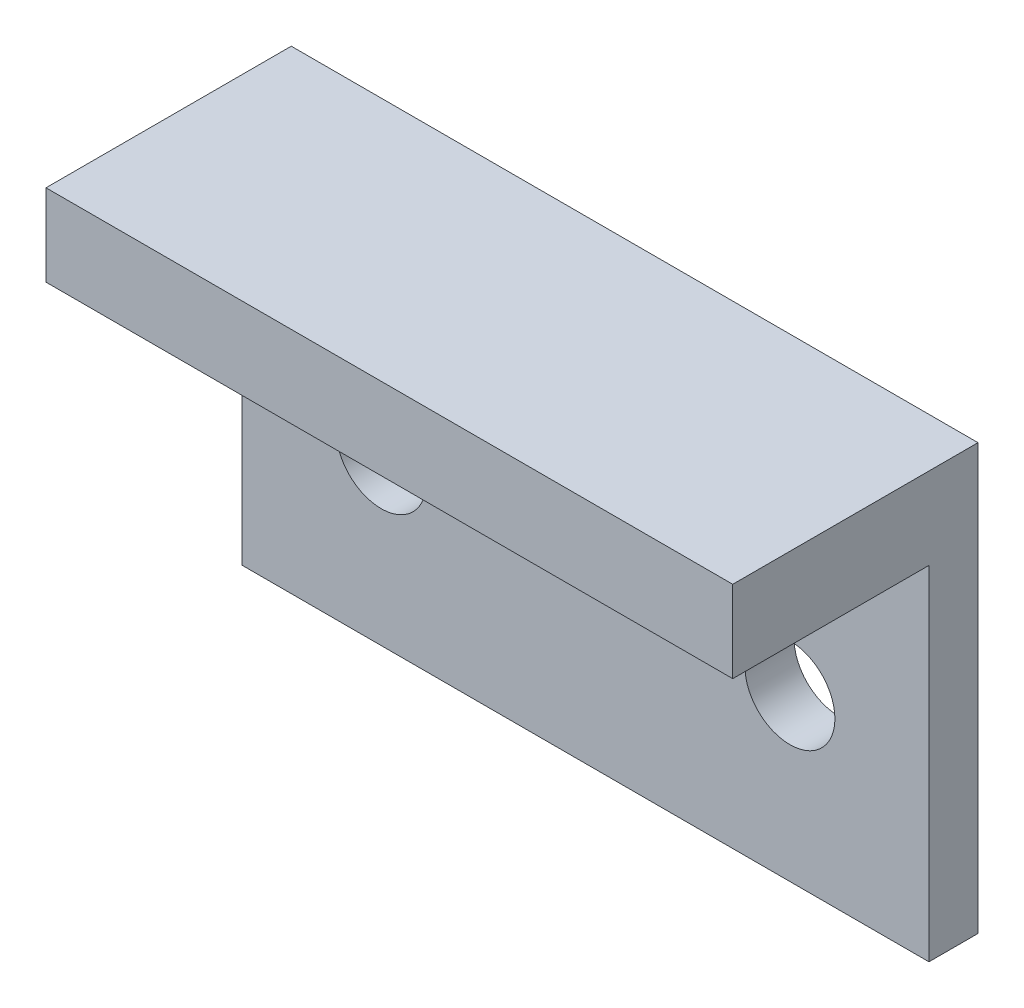
ISO-10303-21;
HEADER;
FILE_DESCRIPTION(('STEP AP214'),'2;1');
FILE_NAME('part.step','',(''),(''),'','','');
FILE_SCHEMA(('AUTOMOTIVE_DESIGN { 1 0 10303 214 1 1 1 1 }'));
ENDSEC;
DATA;
#1=APPLICATION_CONTEXT('core data for automotive mechanical design processes');
#2=APPLICATION_PROTOCOL_DEFINITION('international standard','automotive_design',2000,#1);
#3=PRODUCT_CONTEXT('',#1,'mechanical');
#4=PRODUCT('Part','Part','',(#3));
#5=PRODUCT_RELATED_PRODUCT_CATEGORY('part','',(#4));
#6=PRODUCT_DEFINITION_FORMATION('','',#4);
#7=PRODUCT_DEFINITION_CONTEXT('part definition',#1,'design');
#8=PRODUCT_DEFINITION('design','',#6,#7);
#9=PRODUCT_DEFINITION_SHAPE('','',#8);
#10=(LENGTH_UNIT() NAMED_UNIT(*) SI_UNIT(.MILLI.,.METRE.));
#11=(NAMED_UNIT(*) PLANE_ANGLE_UNIT() SI_UNIT($,.RADIAN.));
#12=(NAMED_UNIT(*) SI_UNIT($,.STERADIAN.) SOLID_ANGLE_UNIT());
#13=UNCERTAINTY_MEASURE_WITH_UNIT(LENGTH_MEASURE(1.E-05),#10,'distance_accuracy_value','');
#14=(GEOMETRIC_REPRESENTATION_CONTEXT(3) GLOBAL_UNCERTAINTY_ASSIGNED_CONTEXT((#13)) GLOBAL_UNIT_ASSIGNED_CONTEXT((#10,
#11,#12)) REPRESENTATION_CONTEXT('',''));
#15=CARTESIAN_POINT('',(0.,0.,0.));
#16=DIRECTION('',(0.,0.,1.));
#17=DIRECTION('',(1.,0.,0.));
#18=AXIS2_PLACEMENT_3D('',#15,#16,#17);
#19=CARTESIAN_POINT('',(0.,0.,1.5));
#20=DIRECTION('',(0.,0.,1.));
#21=DIRECTION('',(1.,0.,0.));
#22=AXIS2_PLACEMENT_3D('',#19,#20,#21);
#23=PLANE('',#22);
#24=DIRECTION('',(1.,0.,0.));
#25=VECTOR('',#24,1.);
#26=CARTESIAN_POINT('',(-21.,-28.5023868071735,1.5));
#27=LINE('',#26,#25);
#28=CARTESIAN_POINT('',(-21.,-28.5023868071735,1.5));
#29=VERTEX_POINT('',#28);
#30=CARTESIAN_POINT('',(21.,-28.5023868071735,1.5));
#31=VERTEX_POINT('',#30);
#32=EDGE_CURVE('E61',#29,#31,#27,.T.);
#33=ORIENTED_EDGE('',*,*,#32,.F.);
#34=DIRECTION('',(0.,-1.,0.));
#35=VECTOR('',#34,1.);
#36=CARTESIAN_POINT('',(-21.,21.,1.5));
#37=LINE('',#36,#35);
#38=CARTESIAN_POINT('',(-21.,-49.5,1.5));
#39=VERTEX_POINT('',#38);
#40=EDGE_CURVE('E54',#29,#39,#37,.T.);
#41=ORIENTED_EDGE('',*,*,#40,.T.);
#42=DIRECTION('',(-1.,0.,0.));
#43=VECTOR('',#42,1.);
#44=CARTESIAN_POINT('',(-21.,-49.5,1.5));
#45=LINE('',#44,#43);
#46=CARTESIAN_POINT('',(21.,-49.5,1.5));
#47=VERTEX_POINT('',#46);
#48=EDGE_CURVE('E132',#47,#39,#45,.T.);
#49=ORIENTED_EDGE('',*,*,#48,.F.);
#50=DIRECTION('',(0.,1.,0.));
#51=VECTOR('',#50,1.);
#52=CARTESIAN_POINT('',(21.,21.,1.5));
#53=LINE('',#52,#51);
#54=EDGE_CURVE('E11',#47,#31,#53,.T.);
#55=ORIENTED_EDGE('',*,*,#54,.T.);
#56=EDGE_LOOP('',(#33,#41,#49,#55));
#57=FACE_BOUND('',#56,.T.);
#58=CARTESIAN_POINT('',(-12.5,-39.5,1.5));
#59=DIRECTION('',(0.,0.,1.));
#60=DIRECTION('',(-1.,0.,0.));
#61=AXIS2_PLACEMENT_3D('',#58,#59,#60);
#62=CIRCLE('',#61,2.75);
#63=CARTESIAN_POINT('',(-15.25,-39.5,1.5));
#64=VERTEX_POINT('',#63);
#65=EDGE_CURVE('E149',#64,#64,#62,.T.);
#66=ORIENTED_EDGE('',*,*,#65,.F.);
#67=EDGE_LOOP('',(#66));
#68=FACE_BOUND('',#67,.T.);
#69=CARTESIAN_POINT('',(12.5,-39.5,1.5));
#70=DIRECTION('',(0.,0.,1.));
#71=DIRECTION('',(1.,0.,0.));
#72=AXIS2_PLACEMENT_3D('',#69,#70,#71);
#73=CIRCLE('',#72,2.75);
#74=CARTESIAN_POINT('',(15.25,-39.5,1.5));
#75=VERTEX_POINT('',#74);
#76=EDGE_CURVE('E146',#75,#75,#73,.T.);
#77=ORIENTED_EDGE('',*,*,#76,.F.);
#78=EDGE_LOOP('',(#77));
#79=FACE_BOUND('',#78,.T.);
#80=ADVANCED_FACE('F45',(#57,#68,#79),#23,.T.);
#81=CARTESIAN_POINT('',(0.,0.,-1.5));
#82=DIRECTION('',(0.,0.,1.));
#83=DIRECTION('',(1.,0.,0.));
#84=AXIS2_PLACEMENT_3D('',#81,#82,#83);
#85=PLANE('',#84);
#86=CARTESIAN_POINT('',(-12.5,-39.5,-1.5));
#87=DIRECTION('',(0.,0.,1.));
#88=DIRECTION('',(-1.,0.,0.));
#89=AXIS2_PLACEMENT_3D('',#86,#87,#88);
#90=CIRCLE('',#89,2.75);
#91=CARTESIAN_POINT('',(-15.25,-39.5,-1.5));
#92=VERTEX_POINT('',#91);
#93=EDGE_CURVE('E141',#92,#92,#90,.T.);
#94=ORIENTED_EDGE('',*,*,#93,.T.);
#95=EDGE_LOOP('',(#94));
#96=FACE_BOUND('',#95,.T.);
#97=CARTESIAN_POINT('',(12.5,-39.5,-1.5));
#98=DIRECTION('',(0.,0.,1.));
#99=DIRECTION('',(1.,0.,0.));
#100=AXIS2_PLACEMENT_3D('',#97,#98,#99);
#101=CIRCLE('',#100,2.75);
#102=CARTESIAN_POINT('',(15.25,-39.5,-1.5));
#103=VERTEX_POINT('',#102);
#104=EDGE_CURVE('E142',#103,#103,#101,.T.);
#105=ORIENTED_EDGE('',*,*,#104,.T.);
#106=EDGE_LOOP('',(#105));
#107=FACE_BOUND('',#106,.T.);
#108=DIRECTION('',(1.,0.,0.));
#109=VECTOR('',#108,1.);
#110=CARTESIAN_POINT('',(0.,-23.5023868071735,-1.5));
#111=LINE('',#110,#109);
#112=CARTESIAN_POINT('',(-21.,-23.5023868071735,-1.5));
#113=VERTEX_POINT('',#112);
#114=CARTESIAN_POINT('',(21.,-23.5023868071735,-1.5));
#115=VERTEX_POINT('',#114);
#116=EDGE_CURVE('E122',#113,#115,#111,.T.);
#117=ORIENTED_EDGE('',*,*,#116,.T.);
#118=DIRECTION('',(0.,1.,0.));
#119=VECTOR('',#118,1.);
#120=CARTESIAN_POINT('',(21.,21.,-1.5));
#121=LINE('',#120,#119);
#122=CARTESIAN_POINT('',(21.,-49.5,-1.5));
#123=VERTEX_POINT('',#122);
#124=EDGE_CURVE('E49',#123,#115,#121,.T.);
#125=ORIENTED_EDGE('',*,*,#124,.F.);
#126=DIRECTION('',(-1.,0.,0.));
#127=VECTOR('',#126,1.);
#128=CARTESIAN_POINT('',(0.,-49.5,-1.5));
#129=LINE('',#128,#127);
#130=CARTESIAN_POINT('',(-21.,-49.5,-1.5));
#131=VERTEX_POINT('',#130);
#132=EDGE_CURVE('E69',#123,#131,#129,.T.);
#133=ORIENTED_EDGE('',*,*,#132,.T.);
#134=DIRECTION('',(0.,-1.,0.));
#135=VECTOR('',#134,1.);
#136=CARTESIAN_POINT('',(-21.,21.,-1.5));
#137=LINE('',#136,#135);
#138=EDGE_CURVE('E145',#113,#131,#137,.T.);
#139=ORIENTED_EDGE('',*,*,#138,.F.);
#140=EDGE_LOOP('',(#117,#125,#133,#139));
#141=FACE_BOUND('',#140,.T.);
#142=ADVANCED_FACE('F161',(#96,#107,#141),#85,.F.);
#143=CARTESIAN_POINT('',(-21.,21.,1.5));
#144=DIRECTION('',(1.,0.,0.));
#145=DIRECTION('',(0.,1.,0.));
#146=AXIS2_PLACEMENT_3D('',#143,#144,#145);
#147=PLANE('',#146);
#148=DIRECTION('',(0.,0.,-1.));
#149=VECTOR('',#148,1.);
#150=CARTESIAN_POINT('',(-21.,-23.5023868071735,8.5));
#151=LINE('',#150,#149);
#152=CARTESIAN_POINT('',(-21.,-23.5023868071735,13.5));
#153=VERTEX_POINT('',#152);
#154=EDGE_CURVE('E125',#153,#113,#151,.T.);
#155=ORIENTED_EDGE('',*,*,#154,.T.);
#156=ORIENTED_EDGE('',*,*,#138,.T.);
#157=DIRECTION('',(0.,0.,1.));
#158=VECTOR('',#157,1.);
#159=CARTESIAN_POINT('',(-21.,-49.5,-8.5));
#160=LINE('',#159,#158);
#161=EDGE_CURVE('E137',#131,#39,#160,.T.);
#162=ORIENTED_EDGE('',*,*,#161,.T.);
#163=ORIENTED_EDGE('',*,*,#40,.F.);
#164=DIRECTION('',(0.,0.,-1.));
#165=VECTOR('',#164,1.);
#166=CARTESIAN_POINT('',(-21.,-28.5023868071735,13.5));
#167=LINE('',#166,#165);
#168=CARTESIAN_POINT('',(-21.,-28.5023868071735,13.5));
#169=VERTEX_POINT('',#168);
#170=EDGE_CURVE('E104',#169,#29,#167,.T.);
#171=ORIENTED_EDGE('',*,*,#170,.F.);
#172=DIRECTION('',(0.,-1.,0.));
#173=VECTOR('',#172,1.);
#174=CARTESIAN_POINT('',(-21.,-23.5023868071735,13.5));
#175=LINE('',#174,#173);
#176=EDGE_CURVE('E111',#153,#169,#175,.T.);
#177=ORIENTED_EDGE('',*,*,#176,.F.);
#178=EDGE_LOOP('',(#155,#156,#162,#163,#171,#177));
#179=FACE_BOUND('',#178,.T.);
#180=ADVANCED_FACE('F47',(#179),#147,.F.);
#181=CARTESIAN_POINT('',(21.,21.,1.5));
#182=DIRECTION('',(-1.,0.,0.));
#183=DIRECTION('',(0.,-1.,0.));
#184=AXIS2_PLACEMENT_3D('',#181,#182,#183);
#185=PLANE('',#184);
#186=DIRECTION('',(0.,0.,-1.));
#187=VECTOR('',#186,1.);
#188=CARTESIAN_POINT('',(21.,-23.5023868071735,8.5));
#189=LINE('',#188,#187);
#190=CARTESIAN_POINT('',(21.,-23.5023868071735,13.5));
#191=VERTEX_POINT('',#190);
#192=EDGE_CURVE('E130',#191,#115,#189,.T.);
#193=ORIENTED_EDGE('',*,*,#192,.F.);
#194=DIRECTION('',(0.,1.,0.));
#195=VECTOR('',#194,1.);
#196=CARTESIAN_POINT('',(21.,-23.5023868071735,13.5));
#197=LINE('',#196,#195);
#198=CARTESIAN_POINT('',(21.,-28.5023868071735,13.5));
#199=VERTEX_POINT('',#198);
#200=EDGE_CURVE('E110',#199,#191,#197,.T.);
#201=ORIENTED_EDGE('',*,*,#200,.F.);
#202=DIRECTION('',(0.,0.,-1.));
#203=VECTOR('',#202,1.);
#204=CARTESIAN_POINT('',(21.,-28.5023868071735,13.5));
#205=LINE('',#204,#203);
#206=EDGE_CURVE('E106',#199,#31,#205,.T.);
#207=ORIENTED_EDGE('',*,*,#206,.T.);
#208=ORIENTED_EDGE('',*,*,#54,.F.);
#209=DIRECTION('',(0.,0.,1.));
#210=VECTOR('',#209,1.);
#211=CARTESIAN_POINT('',(21.,-49.5,-8.5));
#212=LINE('',#211,#210);
#213=EDGE_CURVE('E136',#123,#47,#212,.T.);
#214=ORIENTED_EDGE('',*,*,#213,.F.);
#215=ORIENTED_EDGE('',*,*,#124,.T.);
#216=EDGE_LOOP('',(#193,#201,#207,#208,#214,#215));
#217=FACE_BOUND('',#216,.T.);
#218=ADVANCED_FACE('F158',(#217),#185,.F.);
#219=CARTESIAN_POINT('',(-12.5,-39.5,-1.5));
#220=DIRECTION('',(0.,0.,1.));
#221=DIRECTION('',(1.,0.,0.));
#222=AXIS2_PLACEMENT_3D('',#219,#220,#221);
#223=CYLINDRICAL_SURFACE('',#222,2.75);
#224=ORIENTED_EDGE('',*,*,#93,.F.);
#225=EDGE_LOOP('',(#224));
#226=FACE_BOUND('',#225,.T.);
#227=ORIENTED_EDGE('',*,*,#65,.T.);
#228=EDGE_LOOP('',(#227));
#229=FACE_BOUND('',#228,.T.);
#230=ADVANCED_FACE('F178',(#226,#229),#223,.F.);
#231=CARTESIAN_POINT('',(12.5,-39.5,-1.5));
#232=DIRECTION('',(0.,0.,1.));
#233=DIRECTION('',(1.,0.,0.));
#234=AXIS2_PLACEMENT_3D('',#231,#232,#233);
#235=CYLINDRICAL_SURFACE('',#234,2.75);
#236=ORIENTED_EDGE('',*,*,#104,.F.);
#237=EDGE_LOOP('',(#236));
#238=FACE_BOUND('',#237,.T.);
#239=ORIENTED_EDGE('',*,*,#76,.T.);
#240=EDGE_LOOP('',(#239));
#241=FACE_BOUND('',#240,.T.);
#242=ADVANCED_FACE('F170',(#238,#241),#235,.F.);
#243=CARTESIAN_POINT('',(-21.,-49.5,-8.5));
#244=DIRECTION('',(0.,1.,0.));
#245=DIRECTION('',(0.,0.,1.));
#246=AXIS2_PLACEMENT_3D('',#243,#244,#245);
#247=PLANE('',#246);
#248=ORIENTED_EDGE('',*,*,#213,.T.);
#249=ORIENTED_EDGE('',*,*,#48,.T.);
#250=ORIENTED_EDGE('',*,*,#161,.F.);
#251=ORIENTED_EDGE('',*,*,#132,.F.);
#252=EDGE_LOOP('',(#248,#249,#250,#251));
#253=FACE_BOUND('',#252,.T.);
#254=ADVANCED_FACE('F168',(#253),#247,.F.);
#255=CARTESIAN_POINT('',(0.,-23.5023868071735,8.5));
#256=DIRECTION('',(0.,1.,0.));
#257=DIRECTION('',(0.,0.,1.));
#258=AXIS2_PLACEMENT_3D('',#255,#256,#257);
#259=PLANE('',#258);
#260=ORIENTED_EDGE('',*,*,#192,.T.);
#261=ORIENTED_EDGE('',*,*,#116,.F.);
#262=ORIENTED_EDGE('',*,*,#154,.F.);
#263=DIRECTION('',(-1.,0.,0.));
#264=VECTOR('',#263,1.);
#265=CARTESIAN_POINT('',(-21.,-23.5023868071735,13.5));
#266=LINE('',#265,#264);
#267=EDGE_CURVE('E117',#191,#153,#266,.T.);
#268=ORIENTED_EDGE('',*,*,#267,.F.);
#269=EDGE_LOOP('',(#260,#261,#262,#268));
#270=FACE_BOUND('',#269,.T.);
#271=ADVANCED_FACE('F163',(#270),#259,.T.);
#272=CARTESIAN_POINT('',(-21.,-28.5023868071735,13.5));
#273=DIRECTION('',(0.,1.,0.));
#274=DIRECTION('',(0.,0.,1.));
#275=AXIS2_PLACEMENT_3D('',#272,#273,#274);
#276=PLANE('',#275);
#277=ORIENTED_EDGE('',*,*,#32,.T.);
#278=ORIENTED_EDGE('',*,*,#206,.F.);
#279=DIRECTION('',(1.,0.,0.));
#280=VECTOR('',#279,1.);
#281=CARTESIAN_POINT('',(-21.,-28.5023868071735,13.5));
#282=LINE('',#281,#280);
#283=EDGE_CURVE('E100',#169,#199,#282,.T.);
#284=ORIENTED_EDGE('',*,*,#283,.F.);
#285=ORIENTED_EDGE('',*,*,#170,.T.);
#286=EDGE_LOOP('',(#277,#278,#284,#285));
#287=FACE_BOUND('',#286,.T.);
#288=ADVANCED_FACE('F102',(#287),#276,.F.);
#289=CARTESIAN_POINT('',(0.,0.,13.5));
#290=DIRECTION('',(0.,0.,1.));
#291=DIRECTION('',(1.,0.,0.));
#292=AXIS2_PLACEMENT_3D('',#289,#290,#291);
#293=PLANE('',#292);
#294=ORIENTED_EDGE('',*,*,#176,.T.);
#295=ORIENTED_EDGE('',*,*,#283,.T.);
#296=ORIENTED_EDGE('',*,*,#200,.T.);
#297=ORIENTED_EDGE('',*,*,#267,.T.);
#298=EDGE_LOOP('',(#294,#295,#296,#297));
#299=FACE_BOUND('',#298,.T.);
#300=ADVANCED_FACE('F115',(#299),#293,.T.);
#301=CLOSED_SHELL('',(#80,#142,#180,#218,#230,#242,#254,#271,#288,#300));
#302=MANIFOLD_SOLID_BREP('B2',#301);
#303=ADVANCED_BREP_SHAPE_REPRESENTATION('',(#18,#302),#14);
#304=SHAPE_DEFINITION_REPRESENTATION(#9,#303);
ENDSEC;
END-ISO-10303-21;
